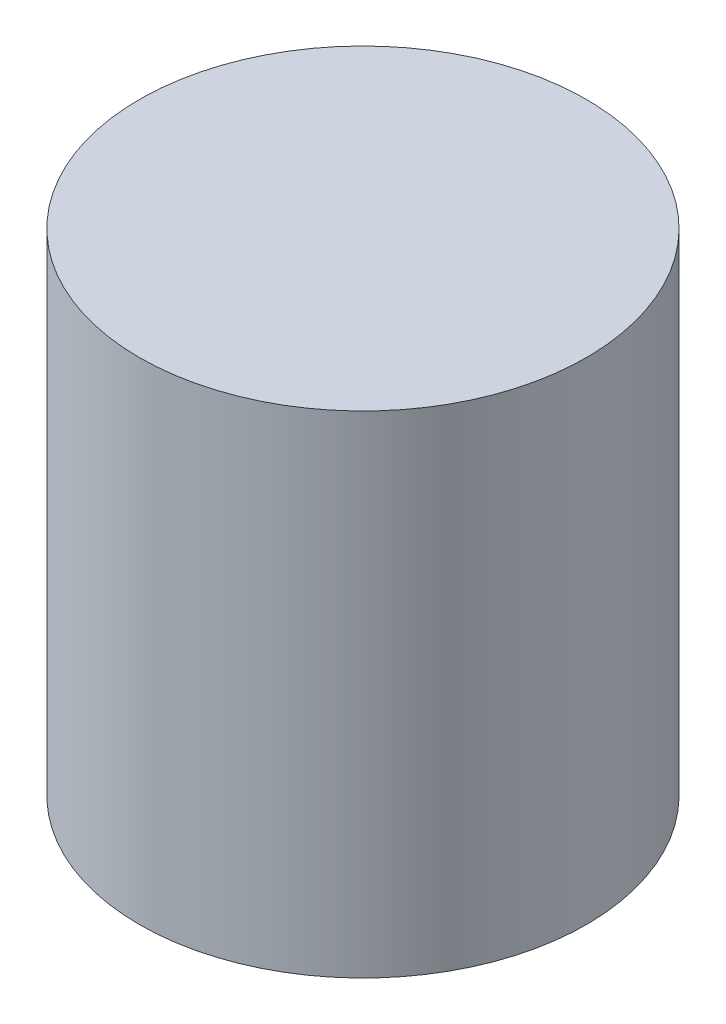
ISO-10303-21;
HEADER;
FILE_DESCRIPTION(('STEP AP214'),'2;1');
FILE_NAME('part.step','',(''),(''),'','','');
FILE_SCHEMA(('AUTOMOTIVE_DESIGN { 1 0 10303 214 1 1 1 1 }'));
ENDSEC;
DATA;
#1=APPLICATION_CONTEXT('core data for automotive mechanical design processes');
#2=APPLICATION_PROTOCOL_DEFINITION('international standard','automotive_design',2000,#1);
#3=PRODUCT_CONTEXT('',#1,'mechanical');
#4=PRODUCT('Part','Part','',(#3));
#5=PRODUCT_RELATED_PRODUCT_CATEGORY('part','',(#4));
#6=PRODUCT_DEFINITION_FORMATION('','',#4);
#7=PRODUCT_DEFINITION_CONTEXT('part definition',#1,'design');
#8=PRODUCT_DEFINITION('design','',#6,#7);
#9=PRODUCT_DEFINITION_SHAPE('','',#8);
#10=(LENGTH_UNIT() NAMED_UNIT(*) SI_UNIT(.MILLI.,.METRE.));
#11=(NAMED_UNIT(*) PLANE_ANGLE_UNIT() SI_UNIT($,.RADIAN.));
#12=(NAMED_UNIT(*) SI_UNIT($,.STERADIAN.) SOLID_ANGLE_UNIT());
#13=UNCERTAINTY_MEASURE_WITH_UNIT(LENGTH_MEASURE(1.E-05),#10,'distance_accuracy_value','');
#14=(GEOMETRIC_REPRESENTATION_CONTEXT(3) GLOBAL_UNCERTAINTY_ASSIGNED_CONTEXT((#13)) GLOBAL_UNIT_ASSIGNED_CONTEXT((#10,
#11,#12)) REPRESENTATION_CONTEXT('',''));
#15=CARTESIAN_POINT('',(0.,0.,0.));
#16=DIRECTION('',(0.,0.,1.));
#17=DIRECTION('',(1.,0.,0.));
#18=AXIS2_PLACEMENT_3D('',#15,#16,#17);
#19=CARTESIAN_POINT('',(-33.8408657602751,2.79,-9.81363636363636));
#20=DIRECTION('',(0.,-1.,0.));
#21=DIRECTION('',(0.,0.,-1.));
#22=AXIS2_PLACEMENT_3D('',#19,#20,#21);
#23=CYLINDRICAL_SURFACE('',#22,1.27);
#24=CARTESIAN_POINT('',(-33.8408657602751,2.79,-9.81363636363636));
#25=DIRECTION('',(0.,1.,0.));
#26=DIRECTION('',(0.,0.,1.));
#27=AXIS2_PLACEMENT_3D('',#24,#25,#26);
#28=CIRCLE('',#27,1.27);
#29=CARTESIAN_POINT('',(-33.8408657602751,2.79,-8.54363636363636));
#30=VERTEX_POINT('',#29);
#31=EDGE_CURVE('E10',#30,#30,#28,.T.);
#32=ORIENTED_EDGE('',*,*,#31,.F.);
#33=EDGE_LOOP('',(#32));
#34=FACE_BOUND('',#33,.T.);
#35=CARTESIAN_POINT('',(-33.8408657602751,0.,-9.81363636363636));
#36=DIRECTION('',(0.,1.,0.));
#37=DIRECTION('',(0.,0.,1.));
#38=AXIS2_PLACEMENT_3D('',#35,#36,#37);
#39=CIRCLE('',#38,1.27);
#40=CARTESIAN_POINT('',(-33.8408657602751,0.,-8.54363636363636));
#41=VERTEX_POINT('',#40);
#42=EDGE_CURVE('E36',#41,#41,#39,.T.);
#43=ORIENTED_EDGE('',*,*,#42,.T.);
#44=EDGE_LOOP('',(#43));
#45=FACE_BOUND('',#44,.T.);
#46=ADVANCED_FACE('F33',(#34,#45),#23,.T.);
#47=CARTESIAN_POINT('',(-33.8408657602751,2.79,-9.81363636363636));
#48=DIRECTION('',(0.,1.,0.));
#49=DIRECTION('',(0.,0.,1.));
#50=AXIS2_PLACEMENT_3D('',#47,#48,#49);
#51=PLANE('',#50);
#52=ORIENTED_EDGE('',*,*,#31,.T.);
#53=EDGE_LOOP('',(#52));
#54=FACE_BOUND('',#53,.T.);
#55=ADVANCED_FACE('F62',(#54),#51,.T.);
#56=CARTESIAN_POINT('',(-33.8408657602751,0.,-9.81363636363636));
#57=DIRECTION('',(0.,1.,0.));
#58=DIRECTION('',(0.,0.,1.));
#59=AXIS2_PLACEMENT_3D('',#56,#57,#58);
#60=PLANE('',#59);
#61=CARTESIAN_POINT('',(-33.8408657602751,0.,-9.81363636363636));
#62=DIRECTION('',(0.,-1.,0.));
#63=DIRECTION('',(0.,0.,-1.));
#64=AXIS2_PLACEMENT_3D('',#61,#62,#63);
#65=CIRCLE('',#64,0.999999999999998);
#66=CARTESIAN_POINT('',(-33.8408657602751,0.,-10.8136363636364));
#67=VERTEX_POINT('',#66);
#68=EDGE_CURVE('E45',#67,#67,#65,.T.);
#69=ORIENTED_EDGE('',*,*,#68,.F.);
#70=EDGE_LOOP('',(#69));
#71=FACE_BOUND('',#70,.T.);
#72=ORIENTED_EDGE('',*,*,#42,.F.);
#73=EDGE_LOOP('',(#72));
#74=FACE_BOUND('',#73,.T.);
#75=ADVANCED_FACE('F56',(#71,#74),#60,.F.);
#76=CARTESIAN_POINT('',(-33.8408657602751,1.5,-9.81363636363636));
#77=DIRECTION('',(0.,-1.,0.));
#78=DIRECTION('',(0.,0.,-1.));
#79=AXIS2_PLACEMENT_3D('',#76,#77,#78);
#80=CYLINDRICAL_SURFACE('',#79,0.999999999999998);
#81=CARTESIAN_POINT('',(-33.8408657602751,1.5,-9.81363636363636));
#82=DIRECTION('',(0.,-1.,0.));
#83=DIRECTION('',(0.,0.,-1.));
#84=AXIS2_PLACEMENT_3D('',#81,#82,#83);
#85=CIRCLE('',#84,0.999999999999998);
#86=CARTESIAN_POINT('',(-33.8408657602751,1.5,-10.8136363636364));
#87=VERTEX_POINT('',#86);
#88=EDGE_CURVE('E43',#87,#87,#85,.T.);
#89=ORIENTED_EDGE('',*,*,#88,.F.);
#90=EDGE_LOOP('',(#89));
#91=FACE_BOUND('',#90,.T.);
#92=ORIENTED_EDGE('',*,*,#68,.T.);
#93=EDGE_LOOP('',(#92));
#94=FACE_BOUND('',#93,.T.);
#95=ADVANCED_FACE('F53',(#91,#94),#80,.F.);
#96=CARTESIAN_POINT('',(-33.8408657602751,1.5,-9.81363636363636));
#97=DIRECTION('',(0.,-1.,0.));
#98=DIRECTION('',(0.,0.,-1.));
#99=AXIS2_PLACEMENT_3D('',#96,#97,#98);
#100=PLANE('',#99);
#101=ORIENTED_EDGE('',*,*,#88,.T.);
#102=EDGE_LOOP('',(#101));
#103=FACE_BOUND('',#102,.T.);
#104=ADVANCED_FACE('F51',(#103),#100,.T.);
#105=CLOSED_SHELL('',(#46,#55,#75,#95,#104));
#106=MANIFOLD_SOLID_BREP('B2',#105);
#107=ADVANCED_BREP_SHAPE_REPRESENTATION('',(#18,#106),#14);
#108=SHAPE_DEFINITION_REPRESENTATION(#9,#107);
ENDSEC;
END-ISO-10303-21;
